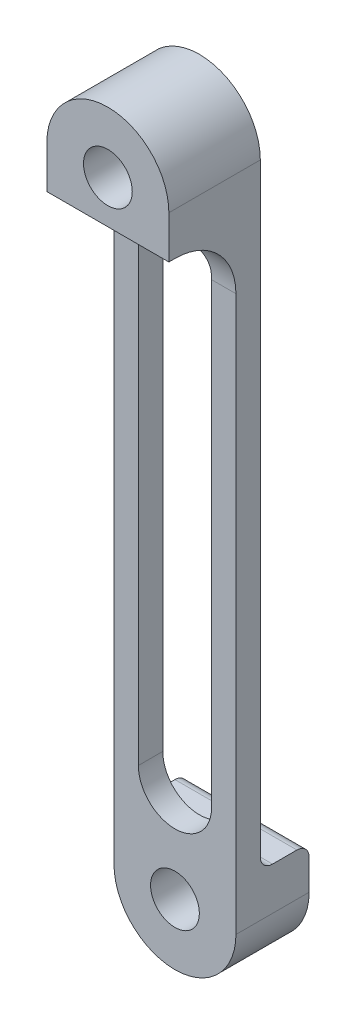
ISO-10303-21;
HEADER;
FILE_DESCRIPTION(('STEP AP214'),'2;1');
FILE_NAME('part.step','',(''),(''),'','','');
FILE_SCHEMA(('AUTOMOTIVE_DESIGN { 1 0 10303 214 1 1 1 1 }'));
ENDSEC;
DATA;
#1=APPLICATION_CONTEXT('core data for automotive mechanical design processes');
#2=APPLICATION_PROTOCOL_DEFINITION('international standard','automotive_design',2000,#1);
#3=PRODUCT_CONTEXT('',#1,'mechanical');
#4=PRODUCT('Part','Part','',(#3));
#5=PRODUCT_RELATED_PRODUCT_CATEGORY('part','',(#4));
#6=PRODUCT_DEFINITION_FORMATION('','',#4);
#7=PRODUCT_DEFINITION_CONTEXT('part definition',#1,'design');
#8=PRODUCT_DEFINITION('design','',#6,#7);
#9=PRODUCT_DEFINITION_SHAPE('','',#8);
#10=(LENGTH_UNIT() NAMED_UNIT(*) SI_UNIT(.MILLI.,.METRE.));
#11=(NAMED_UNIT(*) PLANE_ANGLE_UNIT() SI_UNIT($,.RADIAN.));
#12=(NAMED_UNIT(*) SI_UNIT($,.STERADIAN.) SOLID_ANGLE_UNIT());
#13=UNCERTAINTY_MEASURE_WITH_UNIT(LENGTH_MEASURE(1.E-05),#10,'distance_accuracy_value','');
#14=(GEOMETRIC_REPRESENTATION_CONTEXT(3) GLOBAL_UNCERTAINTY_ASSIGNED_CONTEXT((#13)) GLOBAL_UNIT_ASSIGNED_CONTEXT((#10,
#11,#12)) REPRESENTATION_CONTEXT('',''));
#15=CARTESIAN_POINT('',(0.,0.,0.));
#16=DIRECTION('',(0.,0.,1.));
#17=DIRECTION('',(1.,0.,0.));
#18=AXIS2_PLACEMENT_3D('',#15,#16,#17);
#19=CARTESIAN_POINT('',(0.,0.,4.));
#20=DIRECTION('',(0.,0.,1.));
#21=DIRECTION('',(1.,0.,0.));
#22=AXIS2_PLACEMENT_3D('',#19,#20,#21);
#23=PLANE('',#22);
#24=DIRECTION('',(0.,-1.,0.));
#25=VECTOR('',#24,1.);
#26=CARTESIAN_POINT('',(10.,0.,4.));
#27=LINE('',#26,#25);
#28=CARTESIAN_POINT('',(10.,37.,4.));
#29=VERTEX_POINT('',#28);
#30=CARTESIAN_POINT('',(9.99999999999999,-54.,4.));
#31=VERTEX_POINT('',#30);
#32=EDGE_CURVE('E320',#29,#31,#27,.T.);
#33=ORIENTED_EDGE('',*,*,#32,.F.);
#34=DIRECTION('',(-1.,0.,0.));
#35=VECTOR('',#34,1.);
#36=CARTESIAN_POINT('',(0.,37.,4.));
#37=LINE('',#36,#35);
#38=CARTESIAN_POINT('',(5.99999999999999,37.,4.));
#39=VERTEX_POINT('',#38);
#40=EDGE_CURVE('E419',#29,#39,#37,.T.);
#41=ORIENTED_EDGE('',*,*,#40,.T.);
#42=DIRECTION('',(0.,-1.,0.));
#43=VECTOR('',#42,1.);
#44=CARTESIAN_POINT('',(5.99999999999999,0.,4.));
#45=LINE('',#44,#43);
#46=CARTESIAN_POINT('',(5.99999999999999,-38.,4.));
#47=VERTEX_POINT('',#46);
#48=EDGE_CURVE('E332',#39,#47,#45,.T.);
#49=ORIENTED_EDGE('',*,*,#48,.T.);
#50=CARTESIAN_POINT('',(0.,-38.,4.));
#51=DIRECTION('',(0.,0.,1.));
#52=DIRECTION('',(1.,0.,0.));
#53=AXIS2_PLACEMENT_3D('',#50,#51,#52);
#54=CIRCLE('',#53,6.00000000000001);
#55=CARTESIAN_POINT('',(-6.00000000000002,-38.,4.));
#56=VERTEX_POINT('',#55);
#57=EDGE_CURVE('E321',#56,#47,#54,.T.);
#58=ORIENTED_EDGE('',*,*,#57,.F.);
#59=DIRECTION('',(0.,-1.,0.));
#60=VECTOR('',#59,1.);
#61=CARTESIAN_POINT('',(-6.00000000000002,0.,4.));
#62=LINE('',#61,#60);
#63=CARTESIAN_POINT('',(-6.00000000000002,37.,4.));
#64=VERTEX_POINT('',#63);
#65=EDGE_CURVE('E330',#64,#56,#62,.T.);
#66=ORIENTED_EDGE('',*,*,#65,.F.);
#67=DIRECTION('',(-1.,0.,0.));
#68=VECTOR('',#67,1.);
#69=CARTESIAN_POINT('',(0.,37.,4.));
#70=LINE('',#69,#68);
#71=CARTESIAN_POINT('',(-9.99999999999999,37.,4.));
#72=VERTEX_POINT('',#71);
#73=EDGE_CURVE('E411',#64,#72,#70,.T.);
#74=ORIENTED_EDGE('',*,*,#73,.T.);
#75=DIRECTION('',(0.,-1.,0.));
#76=VECTOR('',#75,1.);
#77=CARTESIAN_POINT('',(-9.99999999999999,0.,4.));
#78=LINE('',#77,#76);
#79=CARTESIAN_POINT('',(-9.99999999999999,-54.,4.));
#80=VERTEX_POINT('',#79);
#81=EDGE_CURVE('E318',#72,#80,#78,.T.);
#82=ORIENTED_EDGE('',*,*,#81,.T.);
#83=CARTESIAN_POINT('',(0.,-54.,4.));
#84=DIRECTION('',(0.,0.,1.));
#85=DIRECTION('',(1.,0.,0.));
#86=AXIS2_PLACEMENT_3D('',#83,#84,#85);
#87=CIRCLE('',#86,10.);
#88=EDGE_CURVE('E373',#80,#31,#87,.T.);
#89=ORIENTED_EDGE('',*,*,#88,.T.);
#90=EDGE_LOOP('',(#33,#41,#49,#58,#66,#74,#82,#89));
#91=FACE_BOUND('',#90,.T.);
#92=CARTESIAN_POINT('',(0.,-54.,4.));
#93=DIRECTION('',(0.,0.,1.));
#94=DIRECTION('',(1.,0.,0.));
#95=AXIS2_PLACEMENT_3D('',#92,#93,#94);
#96=CIRCLE('',#95,4.);
#97=CARTESIAN_POINT('',(3.99999999999999,-54.,4.));
#98=VERTEX_POINT('',#97);
#99=EDGE_CURVE('E312',#98,#98,#96,.T.);
#100=ORIENTED_EDGE('',*,*,#99,.F.);
#101=EDGE_LOOP('',(#100));
#102=FACE_BOUND('',#101,.T.);
#103=ADVANCED_FACE('F131',(#91,#102),#23,.T.);
#104=CARTESIAN_POINT('',(0.,0.,0.));
#105=DIRECTION('',(0.,0.,1.));
#106=DIRECTION('',(1.,0.,0.));
#107=AXIS2_PLACEMENT_3D('',#104,#105,#106);
#108=PLANE('',#107);
#109=DIRECTION('',(0.,-1.,0.));
#110=VECTOR('',#109,1.);
#111=CARTESIAN_POINT('',(10.,0.,0.));
#112=LINE('',#111,#110);
#113=CARTESIAN_POINT('',(10.,54.,0.));
#114=VERTEX_POINT('',#113);
#115=CARTESIAN_POINT('',(10.,-45.,0.));
#116=VERTEX_POINT('',#115);
#117=EDGE_CURVE('E253',#114,#116,#112,.T.);
#118=ORIENTED_EDGE('',*,*,#117,.T.);
#119=DIRECTION('',(1.,0.,0.));
#120=VECTOR('',#119,1.);
#121=CARTESIAN_POINT('',(-9.99999999999999,-45.,0.));
#122=LINE('',#121,#120);
#123=CARTESIAN_POINT('',(-9.99999999999999,-45.,0.));
#124=VERTEX_POINT('',#123);
#125=EDGE_CURVE('E398',#116,#124,#122,.F.);
#126=ORIENTED_EDGE('',*,*,#125,.T.);
#127=DIRECTION('',(0.,-1.,0.));
#128=VECTOR('',#127,1.);
#129=CARTESIAN_POINT('',(-9.99999999999999,0.,0.));
#130=LINE('',#129,#128);
#131=CARTESIAN_POINT('',(-9.99999999999999,54.,0.));
#132=VERTEX_POINT('',#131);
#133=EDGE_CURVE('E338',#132,#124,#130,.T.);
#134=ORIENTED_EDGE('',*,*,#133,.F.);
#135=CARTESIAN_POINT('',(0.,54.,0.));
#136=DIRECTION('',(0.,0.,1.));
#137=DIRECTION('',(1.,0.,0.));
#138=AXIS2_PLACEMENT_3D('',#135,#136,#137);
#139=CIRCLE('',#138,10.);
#140=EDGE_CURVE('E337',#114,#132,#139,.T.);
#141=ORIENTED_EDGE('',*,*,#140,.F.);
#142=EDGE_LOOP('',(#118,#126,#134,#141));
#143=FACE_BOUND('',#142,.T.);
#144=CARTESIAN_POINT('',(0.,-38.,0.));
#145=DIRECTION('',(0.,0.,1.));
#146=DIRECTION('',(1.,0.,0.));
#147=AXIS2_PLACEMENT_3D('',#144,#145,#146);
#148=CIRCLE('',#147,6.00000000000001);
#149=CARTESIAN_POINT('',(-6.00000000000002,-38.,0.));
#150=VERTEX_POINT('',#149);
#151=CARTESIAN_POINT('',(5.99999999999999,-38.,0.));
#152=VERTEX_POINT('',#151);
#153=EDGE_CURVE('E344',#150,#152,#148,.T.);
#154=ORIENTED_EDGE('',*,*,#153,.T.);
#155=DIRECTION('',(0.,-1.,0.));
#156=VECTOR('',#155,1.);
#157=CARTESIAN_POINT('',(5.99999999999999,0.,0.));
#158=LINE('',#157,#156);
#159=CARTESIAN_POINT('',(5.99999999999999,38.,0.));
#160=VERTEX_POINT('',#159);
#161=EDGE_CURVE('E322',#160,#152,#158,.T.);
#162=ORIENTED_EDGE('',*,*,#161,.F.);
#163=CARTESIAN_POINT('',(0.,38.,0.));
#164=DIRECTION('',(0.,0.,1.));
#165=DIRECTION('',(1.,0.,0.));
#166=AXIS2_PLACEMENT_3D('',#163,#164,#165);
#167=CIRCLE('',#166,6.00000000000001);
#168=CARTESIAN_POINT('',(-6.00000000000002,38.,0.));
#169=VERTEX_POINT('',#168);
#170=EDGE_CURVE('E352',#160,#169,#167,.T.);
#171=ORIENTED_EDGE('',*,*,#170,.T.);
#172=DIRECTION('',(0.,-1.,0.));
#173=VECTOR('',#172,1.);
#174=CARTESIAN_POINT('',(-6.00000000000002,0.,0.));
#175=LINE('',#174,#173);
#176=EDGE_CURVE('E349',#169,#150,#175,.T.);
#177=ORIENTED_EDGE('',*,*,#176,.T.);
#178=EDGE_LOOP('',(#154,#162,#171,#177));
#179=FACE_BOUND('',#178,.T.);
#180=ADVANCED_FACE('F481',(#143,#179),#108,.F.);
#181=CARTESIAN_POINT('',(5.99999999999999,0.,4.));
#182=DIRECTION('',(1.,0.,0.));
#183=DIRECTION('',(0.,0.,-1.));
#184=AXIS2_PLACEMENT_3D('',#181,#182,#183);
#185=PLANE('',#184);
#186=ORIENTED_EDGE('',*,*,#161,.T.);
#187=DIRECTION('',(0.,0.,-1.));
#188=VECTOR('',#187,1.);
#189=CARTESIAN_POINT('',(5.99999999999999,-38.,4.));
#190=LINE('',#189,#188);
#191=EDGE_CURVE('E258',#47,#152,#190,.T.);
#192=ORIENTED_EDGE('',*,*,#191,.F.);
#193=ORIENTED_EDGE('',*,*,#48,.F.);
#194=CARTESIAN_POINT('',(5.99999999999999,37.,14.));
#195=DIRECTION('',(1.,0.,0.));
#196=DIRECTION('',(0.,0.,-1.));
#197=AXIS2_PLACEMENT_3D('',#194,#195,#196);
#198=CIRCLE('',#197,10.);
#199=CARTESIAN_POINT('',(5.99999999999999,38.,4.0501256289338));
#200=VERTEX_POINT('',#199);
#201=EDGE_CURVE('E425',#39,#200,#198,.T.);
#202=ORIENTED_EDGE('',*,*,#201,.T.);
#203=DIRECTION('',(0.,0.,-1.));
#204=VECTOR('',#203,1.);
#205=CARTESIAN_POINT('',(5.99999999999999,38.,4.));
#206=LINE('',#205,#204);
#207=EDGE_CURVE('E160',#200,#160,#206,.T.);
#208=ORIENTED_EDGE('',*,*,#207,.T.);
#209=EDGE_LOOP('',(#186,#192,#193,#202,#208));
#210=FACE_BOUND('',#209,.T.);
#211=ADVANCED_FACE('F445',(#210),#185,.F.);
#212=CARTESIAN_POINT('',(0.,-38.,4.));
#213=DIRECTION('',(0.,0.,-1.));
#214=DIRECTION('',(-1.,0.,0.));
#215=AXIS2_PLACEMENT_3D('',#212,#213,#214);
#216=CYLINDRICAL_SURFACE('',#215,6.00000000000001);
#217=ORIENTED_EDGE('',*,*,#153,.F.);
#218=DIRECTION('',(0.,0.,-1.));
#219=VECTOR('',#218,1.);
#220=CARTESIAN_POINT('',(-6.00000000000002,-38.,4.));
#221=LINE('',#220,#219);
#222=EDGE_CURVE('E364',#56,#150,#221,.T.);
#223=ORIENTED_EDGE('',*,*,#222,.F.);
#224=ORIENTED_EDGE('',*,*,#57,.T.);
#225=ORIENTED_EDGE('',*,*,#191,.T.);
#226=EDGE_LOOP('',(#217,#223,#224,#225));
#227=FACE_BOUND('',#226,.T.);
#228=ADVANCED_FACE('F447',(#227),#216,.F.);
#229=CARTESIAN_POINT('',(-6.00000000000002,0.,4.));
#230=DIRECTION('',(1.,0.,0.));
#231=DIRECTION('',(0.,0.,-1.));
#232=AXIS2_PLACEMENT_3D('',#229,#230,#231);
#233=PLANE('',#232);
#234=ORIENTED_EDGE('',*,*,#176,.F.);
#235=DIRECTION('',(0.,0.,-1.));
#236=VECTOR('',#235,1.);
#237=CARTESIAN_POINT('',(-6.00000000000002,38.,4.));
#238=LINE('',#237,#236);
#239=CARTESIAN_POINT('',(-6.00000000000002,38.,4.0501256289338));
#240=VERTEX_POINT('',#239);
#241=EDGE_CURVE('E152',#240,#169,#238,.T.);
#242=ORIENTED_EDGE('',*,*,#241,.F.);
#243=CARTESIAN_POINT('',(-6.00000000000002,37.,14.));
#244=DIRECTION('',(1.,0.,0.));
#245=DIRECTION('',(0.,0.,-1.));
#246=AXIS2_PLACEMENT_3D('',#243,#244,#245);
#247=CIRCLE('',#246,10.);
#248=EDGE_CURVE('E434',#240,#64,#247,.F.);
#249=ORIENTED_EDGE('',*,*,#248,.T.);
#250=ORIENTED_EDGE('',*,*,#65,.T.);
#251=ORIENTED_EDGE('',*,*,#222,.T.);
#252=EDGE_LOOP('',(#234,#242,#249,#250,#251));
#253=FACE_BOUND('',#252,.T.);
#254=ADVANCED_FACE('F441',(#253),#233,.T.);
#255=CARTESIAN_POINT('',(0.,38.,4.));
#256=DIRECTION('',(0.,0.,-1.));
#257=DIRECTION('',(-1.,0.,0.));
#258=AXIS2_PLACEMENT_3D('',#255,#256,#257);
#259=CYLINDRICAL_SURFACE('',#258,6.00000000000001);
#260=ORIENTED_EDGE('',*,*,#170,.F.);
#261=ORIENTED_EDGE('',*,*,#207,.F.);
#262=CARTESIAN_POINT('',(5.99999999999999,38.,4.0501256289338));
#263=CARTESIAN_POINT('',(6.0000294951596,38.1591175187493,4.06608293057429));
#264=CARTESIAN_POINT('',(5.99367212509251,38.3178105674028,4.08592065296171));
#265=CARTESIAN_POINT('',(5.96860004965311,38.6330020197956,4.13295942524133));
#266=CARTESIAN_POINT('',(5.94989436154212,38.7895019399501,4.16015509350608));
#267=CARTESIAN_POINT('',(5.90069490388108,39.0982307316092,4.22134509223627));
#268=CARTESIAN_POINT('',(5.87027543348815,39.2504801632662,4.25529593229296));
#269=CARTESIAN_POINT('',(5.7981979236528,39.5507212780291,4.32954337511306));
#270=CARTESIAN_POINT('',(5.75653821567016,39.6987123253931,4.36984091963352));
#271=CARTESIAN_POINT('',(5.66273347676998,39.9891372133211,4.45600022435041));
#272=CARTESIAN_POINT('',(5.61061972958902,40.1315861551653,4.50184522510344));
#273=CARTESIAN_POINT('',(5.49646333293458,40.410737683907,4.59847226930764));
#274=CARTESIAN_POINT('',(5.43441688028624,40.5474380442883,4.64925620091144));
#275=CARTESIAN_POINT('',(5.23419168500289,40.9482931524451,4.80796840596734));
#276=CARTESIAN_POINT('',(5.08196517314529,41.2030861169894,4.92222183327461));
#277=CARTESIAN_POINT('',(4.72700902510743,41.7095847876954,5.17344560921815));
#278=CARTESIAN_POINT('',(4.52065498084985,41.9581576138449,5.311541599));
#279=CARTESIAN_POINT('',(4.07151863059318,42.4188676858128,5.59116780926577));
#280=CARTESIAN_POINT('',(3.82866845263922,42.6309354324219,5.73270400751313));
#281=CARTESIAN_POINT('',(3.42157838573368,42.9321887492625,5.94846075171384));
#282=CARTESIAN_POINT('',(3.26861110983556,43.0349235630671,6.02538504951066));
#283=CARTESIAN_POINT('',(2.95199395538532,43.2268537011576,6.17433589210791));
#284=CARTESIAN_POINT('',(2.78834099569062,43.3160450954189,6.2463610119323));
#285=CARTESIAN_POINT('',(2.45130504733917,43.4796072515253,6.38252058251944));
#286=CARTESIAN_POINT('',(2.27795188895556,43.5540205602045,6.44667747615086));
#287=CARTESIAN_POINT('',(1.92182067944011,43.6870608145333,6.56420100149436));
#288=CARTESIAN_POINT('',(1.73905022937201,43.7457002612277,6.61757616949508));
#289=CARTESIAN_POINT('',(1.43397156489431,43.8274126503987,6.6932702328874));
#290=CARTESIAN_POINT('',(1.31406535169195,43.8556429960359,6.71980054156605));
#291=CARTESIAN_POINT('',(1.07155591266237,43.9048336605978,6.76643763775028));
#292=CARTESIAN_POINT('',(0.948953551335206,43.92579627474,6.78654645306488));
#293=CARTESIAN_POINT('',(0.701890617956236,43.9601077108383,6.81964687541727));
#294=CARTESIAN_POINT('',(0.577432595240377,43.973466139441,6.83264746171744));
#295=CARTESIAN_POINT('',(0.327356567361795,43.9923751001517,6.85109330345357));
#296=CARTESIAN_POINT('',(0.201738529570265,43.9979254119561,6.8565383457122));
#297=CARTESIAN_POINT('',(-0.0499724301037092,44.0011148465854,6.85966412555106));
#298=CARTESIAN_POINT('',(-0.176065788765368,43.9987365405341,6.8573277578616));
#299=CARTESIAN_POINT('',(-0.427466693636261,43.9860767055142,6.8449452031245));
#300=CARTESIAN_POINT('',(-0.552774253039173,43.9757953095997,6.8348991458749));
#301=CARTESIAN_POINT('',(-0.801796803030101,43.9475069706706,6.80746687048065));
#302=CARTESIAN_POINT('',(-0.925510420988328,43.9294937748418,6.79007471162358));
#303=CARTESIAN_POINT('',(-1.17052168133062,43.8860320042462,6.74855441795779));
#304=CARTESIAN_POINT('',(-1.29181807779596,43.8605796958445,6.72442290098697));
#305=CARTESIAN_POINT('',(-1.55981238132584,43.795708710444,6.66373683110122));
#306=CARTESIAN_POINT('',(-1.70569646846691,43.7544084110676,6.62559283290449));
#307=CARTESIAN_POINT('',(-1.99202862151977,43.6616692511934,6.54171152006149));
#308=CARTESIAN_POINT('',(-2.1324726967012,43.6102231102552,6.49596875644075));
#309=CARTESIAN_POINT('',(-2.40757233010485,43.4977916186078,6.39840481262958));
#310=CARTESIAN_POINT('',(-2.54221802081884,43.4367907670592,6.3465737900893));
#311=CARTESIAN_POINT('',(-2.80513700162622,43.3059181214778,6.23838906480572));
#312=CARTESIAN_POINT('',(-2.93341239355271,43.2360492807928,6.18203687005764));
#313=CARTESIAN_POINT('',(-3.2160799982645,43.0685700626666,6.05100595078985));
#314=CARTESIAN_POINT('',(-3.36856518766068,42.9684755355649,5.97537877212671));
#315=CARTESIAN_POINT('',(-3.662942511868,42.7556130837321,5.82135778945502));
#316=CARTESIAN_POINT('',(-3.80483215528341,42.6428421938493,5.74296334110324));
#317=CARTESIAN_POINT('',(-4.07773930855389,42.4050894553705,5.58540787567962));
#318=CARTESIAN_POINT('',(-4.20874879444984,42.2800987401617,5.50624634010113));
#319=CARTESIAN_POINT('',(-4.45926102297536,42.0184315999573,5.3490672283874));
#320=CARTESIAN_POINT('',(-4.57876475258685,41.8817561791966,5.27104955461745));
#321=CARTESIAN_POINT('',(-4.8062789682288,41.5962753489477,5.11739403190589));
#322=CARTESIAN_POINT('',(-4.91421511860866,41.4474012099078,5.04177354638658));
#323=CARTESIAN_POINT('',(-5.11683605940352,41.1387974105401,4.8950818422026));
#324=CARTESIAN_POINT('',(-5.21152288702919,40.9790694247188,4.82400992506576));
#325=CARTESIAN_POINT('',(-5.38631824137914,40.649941477627,4.68820510923198));
#326=CARTESIAN_POINT('',(-5.46646945196341,40.4805718189937,4.62345391705684));
#327=CARTESIAN_POINT('',(-5.61132116732317,40.1327301449577,4.50158284717902));
#328=CARTESIAN_POINT('',(-5.67602624792147,39.9542608443301,4.44446071162887));
#329=CARTESIAN_POINT('',(-5.77574769459048,39.6316568969812,4.35138795932134));
#330=CARTESIAN_POINT('',(-5.8141694886886,39.4890977430194,4.31359303058179));
#331=CARTESIAN_POINT('',(-5.88060418386199,39.200190034776,4.24391278426973));
#332=CARTESIAN_POINT('',(-5.90862038748129,39.0538426985954,4.21202559330242));
#333=CARTESIAN_POINT('',(-5.95391289001359,38.7573184776507,4.15445585240362));
#334=CARTESIAN_POINT('',(-5.97112145039857,38.6071234618042,4.12881304114627));
#335=CARTESIAN_POINT('',(-5.99418207495812,38.3047491695015,4.0842974092484));
#336=CARTESIAN_POINT('',(-6.00002491238777,38.1525683817848,4.06543009911202));
#337=CARTESIAN_POINT('',(-6.00000000000001,38.,4.0501256289338));
#338=B_SPLINE_CURVE_WITH_KNOTS('',3,(#262,#263,#264,#265,#266,#267,#268,#269,#270,#271,#272,
#273,#274,#275,#276,#277,#278,#279,#280,#281,#282,#283,#284,#285,#286,#287,#288,#289,#290,#291,
#292,#293,#294,#295,#296,#297,#298,#299,#300,#301,#302,#303,#304,#305,#306,#307,#308,#309,#310,
#311,#312,#313,#314,#315,#316,#317,#318,#319,#320,#321,#322,#323,#324,#325,#326,#327,#328,#329,
#330,#331,#332,#333,#334,#335,#336,#337),.UNSPECIFIED.,.F.,.F.,(4,2,2,2,2,2,2,2,2,2,2,2,2,2,2,2,
2,2,2,2,2,2,2,2,2,2,2,2,2,2,2,2,2,2,2,2,2,4),(0.,0.479521694057924,0.958693607982544,
1.4348749640435,1.9111270450595,2.38597464886377,2.86100450583572,3.81144088218074,
4.86166678762596,5.91387053962458,6.51224019448164,7.11078315356829,7.70757706674632,
8.30389660809757,8.68157362710421,9.05913126329832,9.43621085241886,9.81330108050651,
10.1912207834066,10.5691341239017,10.9473536657053,11.3257633599833,11.7941017538637,
12.2627774483357,12.7322215161025,13.2015096509353,13.7931124981155,14.3848540173184,
14.9770281321084,15.569151403925,16.1648765737993,16.7605100443156,17.3543650680643,
17.9480439469148,18.4047868716972,18.8613847105076,19.3208165105854,19.7806211240662),.UNSPECIFIED.);
#339=EDGE_CURVE('E430',#200,#240,#338,.T.);
#340=ORIENTED_EDGE('',*,*,#339,.T.);
#341=ORIENTED_EDGE('',*,*,#241,.T.);
#342=EDGE_LOOP('',(#260,#261,#340,#341));
#343=FACE_BOUND('',#342,.T.);
#344=ADVANCED_FACE('F436',(#343),#259,.F.);
#345=CARTESIAN_POINT('',(10.,0.,4.));
#346=DIRECTION('',(1.,0.,0.));
#347=DIRECTION('',(0.,0.,-1.));
#348=AXIS2_PLACEMENT_3D('',#345,#346,#347);
#349=PLANE('',#348);
#350=CARTESIAN_POINT('',(10.,-45.,-2.));
#351=DIRECTION('',(1.,0.,0.));
#352=DIRECTION('',(0.,0.,-1.));
#353=AXIS2_PLACEMENT_3D('',#350,#351,#352);
#354=CIRCLE('',#353,2.);
#355=CARTESIAN_POINT('',(10.,-47.,-2.));
#356=VERTEX_POINT('',#355);
#357=EDGE_CURVE('E404',#356,#116,#354,.F.);
#358=ORIENTED_EDGE('',*,*,#357,.T.);
#359=ORIENTED_EDGE('',*,*,#117,.F.);
#360=DIRECTION('',(0.,0.,-1.));
#361=VECTOR('',#360,1.);
#362=CARTESIAN_POINT('',(10.,54.,4.));
#363=LINE('',#362,#361);
#364=CARTESIAN_POINT('',(10.,54.,15.));
#365=VERTEX_POINT('',#364);
#366=EDGE_CURVE('E247',#365,#114,#363,.T.);
#367=ORIENTED_EDGE('',*,*,#366,.F.);
#368=DIRECTION('',(0.,-1.,0.));
#369=VECTOR('',#368,1.);
#370=CARTESIAN_POINT('',(10.,0.,15.));
#371=LINE('',#370,#369);
#372=CARTESIAN_POINT('',(10.,47.,15.));
#373=VERTEX_POINT('',#372);
#374=EDGE_CURVE('E251',#365,#373,#371,.T.);
#375=ORIENTED_EDGE('',*,*,#374,.T.);
#376=DIRECTION('',(0.,0.,-1.));
#377=VECTOR('',#376,1.);
#378=CARTESIAN_POINT('',(10.,47.,15.));
#379=LINE('',#378,#377);
#380=CARTESIAN_POINT('',(10.,47.,14.));
#381=VERTEX_POINT('',#380);
#382=EDGE_CURVE('E289',#373,#381,#379,.T.);
#383=ORIENTED_EDGE('',*,*,#382,.T.);
#384=CARTESIAN_POINT('',(10.,37.,14.));
#385=DIRECTION('',(1.,0.,0.));
#386=DIRECTION('',(0.,0.,-1.));
#387=AXIS2_PLACEMENT_3D('',#384,#385,#386);
#388=CIRCLE('',#387,10.);
#389=EDGE_CURVE('E12',#381,#29,#388,.F.);
#390=ORIENTED_EDGE('',*,*,#389,.T.);
#391=ORIENTED_EDGE('',*,*,#32,.T.);
#392=DIRECTION('',(0.,0.,-1.));
#393=VECTOR('',#392,1.);
#394=CARTESIAN_POINT('',(9.99999999999999,-54.,4.));
#395=LINE('',#394,#393);
#396=CARTESIAN_POINT('',(10.,-54.,-8.));
#397=VERTEX_POINT('',#396);
#398=EDGE_CURVE('E380',#31,#397,#395,.T.);
#399=ORIENTED_EDGE('',*,*,#398,.T.);
#400=DIRECTION('',(0.,-1.,0.));
#401=VECTOR('',#400,1.);
#402=CARTESIAN_POINT('',(10.,0.,-8.));
#403=LINE('',#402,#401);
#404=CARTESIAN_POINT('',(10.,-49.,-8.));
#405=VERTEX_POINT('',#404);
#406=EDGE_CURVE('E304',#405,#397,#403,.T.);
#407=ORIENTED_EDGE('',*,*,#406,.F.);
#408=CARTESIAN_POINT('',(10.,-49.,-6.));
#409=DIRECTION('',(1.,0.,0.));
#410=DIRECTION('',(0.,0.,-1.));
#411=AXIS2_PLACEMENT_3D('',#408,#409,#410);
#412=CIRCLE('',#411,2.);
#413=CARTESIAN_POINT('',(10.,-47.,-6.));
#414=VERTEX_POINT('',#413);
#415=EDGE_CURVE('E390',#405,#414,#412,.T.);
#416=ORIENTED_EDGE('',*,*,#415,.T.);
#417=DIRECTION('',(0.,0.,1.));
#418=VECTOR('',#417,1.);
#419=CARTESIAN_POINT('',(10.,-47.,-8.));
#420=LINE('',#419,#418);
#421=EDGE_CURVE('E308',#414,#356,#420,.T.);
#422=ORIENTED_EDGE('',*,*,#421,.T.);
#423=EDGE_LOOP('',(#358,#359,#367,#375,#383,#390,#391,#399,#407,#416,#422));
#424=FACE_BOUND('',#423,.T.);
#425=ADVANCED_FACE('F252',(#424),#349,.T.);
#426=CARTESIAN_POINT('',(-9.99999999999999,0.,4.));
#427=DIRECTION('',(1.,0.,0.));
#428=DIRECTION('',(0.,0.,-1.));
#429=AXIS2_PLACEMENT_3D('',#426,#427,#428);
#430=PLANE('',#429);
#431=ORIENTED_EDGE('',*,*,#81,.F.);
#432=CARTESIAN_POINT('',(-9.99999999999999,37.,14.));
#433=DIRECTION('',(1.,0.,0.));
#434=DIRECTION('',(0.,0.,-1.));
#435=AXIS2_PLACEMENT_3D('',#432,#433,#434);
#436=CIRCLE('',#435,10.);
#437=CARTESIAN_POINT('',(-9.99999999999999,47.,14.));
#438=VERTEX_POINT('',#437);
#439=EDGE_CURVE('E144',#72,#438,#436,.T.);
#440=ORIENTED_EDGE('',*,*,#439,.T.);
#441=DIRECTION('',(0.,0.,-1.));
#442=VECTOR('',#441,1.);
#443=CARTESIAN_POINT('',(-9.99999999999999,47.,15.));
#444=LINE('',#443,#442);
#445=CARTESIAN_POINT('',(-9.99999999999999,47.,15.));
#446=VERTEX_POINT('',#445);
#447=EDGE_CURVE('E288',#446,#438,#444,.T.);
#448=ORIENTED_EDGE('',*,*,#447,.F.);
#449=DIRECTION('',(0.,-1.,0.));
#450=VECTOR('',#449,1.);
#451=CARTESIAN_POINT('',(-9.99999999999999,0.,15.));
#452=LINE('',#451,#450);
#453=CARTESIAN_POINT('',(-9.99999999999999,54.,15.));
#454=VERTEX_POINT('',#453);
#455=EDGE_CURVE('E272',#454,#446,#452,.T.);
#456=ORIENTED_EDGE('',*,*,#455,.F.);
#457=DIRECTION('',(0.,0.,-1.));
#458=VECTOR('',#457,1.);
#459=CARTESIAN_POINT('',(-9.99999999999999,54.,4.));
#460=LINE('',#459,#458);
#461=EDGE_CURVE('E262',#454,#132,#460,.T.);
#462=ORIENTED_EDGE('',*,*,#461,.T.);
#463=ORIENTED_EDGE('',*,*,#133,.T.);
#464=CARTESIAN_POINT('',(-9.99999999999999,-45.,-2.));
#465=DIRECTION('',(1.,0.,0.));
#466=DIRECTION('',(0.,0.,-1.));
#467=AXIS2_PLACEMENT_3D('',#464,#465,#466);
#468=CIRCLE('',#467,2.);
#469=CARTESIAN_POINT('',(-9.99999999999999,-47.,-2.));
#470=VERTEX_POINT('',#469);
#471=EDGE_CURVE('E410',#124,#470,#468,.T.);
#472=ORIENTED_EDGE('',*,*,#471,.T.);
#473=DIRECTION('',(0.,0.,1.));
#474=VECTOR('',#473,1.);
#475=CARTESIAN_POINT('',(-9.99999999999999,-47.,-8.));
#476=LINE('',#475,#474);
#477=CARTESIAN_POINT('',(-9.99999999999999,-47.,-6.));
#478=VERTEX_POINT('',#477);
#479=EDGE_CURVE('E307',#478,#470,#476,.T.);
#480=ORIENTED_EDGE('',*,*,#479,.F.);
#481=CARTESIAN_POINT('',(-9.99999999999999,-49.,-6.));
#482=DIRECTION('',(1.,0.,0.));
#483=DIRECTION('',(0.,0.,-1.));
#484=AXIS2_PLACEMENT_3D('',#481,#482,#483);
#485=CIRCLE('',#484,2.);
#486=CARTESIAN_POINT('',(-9.99999999999999,-49.,-8.));
#487=VERTEX_POINT('',#486);
#488=EDGE_CURVE('E399',#478,#487,#485,.F.);
#489=ORIENTED_EDGE('',*,*,#488,.T.);
#490=DIRECTION('',(0.,-1.,0.));
#491=VECTOR('',#490,1.);
#492=CARTESIAN_POINT('',(-9.99999999999999,0.,-8.));
#493=LINE('',#492,#491);
#494=CARTESIAN_POINT('',(-9.99999999999999,-54.,-8.));
#495=VERTEX_POINT('',#494);
#496=EDGE_CURVE('E296',#487,#495,#493,.T.);
#497=ORIENTED_EDGE('',*,*,#496,.T.);
#498=DIRECTION('',(0.,0.,-1.));
#499=VECTOR('',#498,1.);
#500=CARTESIAN_POINT('',(-9.99999999999999,-54.,4.));
#501=LINE('',#500,#499);
#502=EDGE_CURVE('E340',#80,#495,#501,.T.);
#503=ORIENTED_EDGE('',*,*,#502,.F.);
#504=EDGE_LOOP('',(#431,#440,#448,#456,#462,#463,#472,#480,#489,#497,#503));
#505=FACE_BOUND('',#504,.T.);
#506=ADVANCED_FACE('F448',(#505),#430,.F.);
#507=CARTESIAN_POINT('',(0.,54.,4.));
#508=DIRECTION('',(0.,0.,-1.));
#509=DIRECTION('',(-1.,0.,0.));
#510=AXIS2_PLACEMENT_3D('',#507,#508,#509);
#511=CYLINDRICAL_SURFACE('',#510,10.);
#512=ORIENTED_EDGE('',*,*,#140,.T.);
#513=ORIENTED_EDGE('',*,*,#461,.F.);
#514=CARTESIAN_POINT('',(0.,54.,15.));
#515=DIRECTION('',(0.,0.,1.));
#516=DIRECTION('',(1.,0.,0.));
#517=AXIS2_PLACEMENT_3D('',#514,#515,#516);
#518=CIRCLE('',#517,10.);
#519=EDGE_CURVE('E261',#365,#454,#518,.T.);
#520=ORIENTED_EDGE('',*,*,#519,.F.);
#521=ORIENTED_EDGE('',*,*,#366,.T.);
#522=EDGE_LOOP('',(#512,#513,#520,#521));
#523=FACE_BOUND('',#522,.T.);
#524=ADVANCED_FACE('F263',(#523),#511,.T.);
#525=CARTESIAN_POINT('',(0.,-54.,4.));
#526=DIRECTION('',(0.,0.,-1.));
#527=DIRECTION('',(-1.,0.,0.));
#528=AXIS2_PLACEMENT_3D('',#525,#526,#527);
#529=CYLINDRICAL_SURFACE('',#528,4.);
#530=ORIENTED_EDGE('',*,*,#99,.T.);
#531=EDGE_LOOP('',(#530));
#532=FACE_BOUND('',#531,.T.);
#533=CARTESIAN_POINT('',(0.,-54.,-8.));
#534=DIRECTION('',(0.,0.,1.));
#535=DIRECTION('',(1.,0.,0.));
#536=AXIS2_PLACEMENT_3D('',#533,#534,#535);
#537=CIRCLE('',#536,4.);
#538=CARTESIAN_POINT('',(3.99999999999999,-54.,-8.));
#539=VERTEX_POINT('',#538);
#540=EDGE_CURVE('E295',#539,#539,#537,.T.);
#541=ORIENTED_EDGE('',*,*,#540,.F.);
#542=EDGE_LOOP('',(#541));
#543=FACE_BOUND('',#542,.T.);
#544=ADVANCED_FACE('F457',(#532,#543),#529,.F.);
#545=CARTESIAN_POINT('',(0.,-54.,4.));
#546=DIRECTION('',(0.,0.,-1.));
#547=DIRECTION('',(-1.,0.,0.));
#548=AXIS2_PLACEMENT_3D('',#545,#546,#547);
#549=CYLINDRICAL_SURFACE('',#548,10.);
#550=ORIENTED_EDGE('',*,*,#502,.T.);
#551=CARTESIAN_POINT('',(0.,-54.,-8.));
#552=DIRECTION('',(0.,0.,1.));
#553=DIRECTION('',(1.,0.,0.));
#554=AXIS2_PLACEMENT_3D('',#551,#552,#553);
#555=CIRCLE('',#554,10.);
#556=EDGE_CURVE('E301',#495,#397,#555,.T.);
#557=ORIENTED_EDGE('',*,*,#556,.T.);
#558=ORIENTED_EDGE('',*,*,#398,.F.);
#559=ORIENTED_EDGE('',*,*,#88,.F.);
#560=EDGE_LOOP('',(#550,#557,#558,#559));
#561=FACE_BOUND('',#560,.T.);
#562=ADVANCED_FACE('F462',(#561),#549,.T.);
#563=CARTESIAN_POINT('',(0.,-47.,-8.));
#564=DIRECTION('',(0.,-1.,0.));
#565=DIRECTION('',(0.,0.,-1.));
#566=AXIS2_PLACEMENT_3D('',#563,#564,#565);
#567=PLANE('',#566);
#568=ORIENTED_EDGE('',*,*,#421,.F.);
#569=DIRECTION('',(1.,0.,0.));
#570=VECTOR('',#569,1.);
#571=CARTESIAN_POINT('',(0.,-47.,-6.));
#572=LINE('',#571,#570);
#573=EDGE_CURVE('E391',#414,#478,#572,.F.);
#574=ORIENTED_EDGE('',*,*,#573,.T.);
#575=ORIENTED_EDGE('',*,*,#479,.T.);
#576=DIRECTION('',(1.,0.,0.));
#577=VECTOR('',#576,1.);
#578=CARTESIAN_POINT('',(10.,-47.,-2.));
#579=LINE('',#578,#577);
#580=EDGE_CURVE('E388',#470,#356,#579,.T.);
#581=ORIENTED_EDGE('',*,*,#580,.T.);
#582=EDGE_LOOP('',(#568,#574,#575,#581));
#583=FACE_BOUND('',#582,.T.);
#584=ADVANCED_FACE('F463',(#583),#567,.F.);
#585=CARTESIAN_POINT('',(0.,0.,-8.));
#586=DIRECTION('',(0.,0.,1.));
#587=DIRECTION('',(1.,0.,0.));
#588=AXIS2_PLACEMENT_3D('',#585,#586,#587);
#589=PLANE('',#588);
#590=ORIENTED_EDGE('',*,*,#540,.T.);
#591=EDGE_LOOP('',(#590));
#592=FACE_BOUND('',#591,.T.);
#593=ORIENTED_EDGE('',*,*,#496,.F.);
#594=DIRECTION('',(1.,0.,0.));
#595=VECTOR('',#594,1.);
#596=CARTESIAN_POINT('',(0.,-49.,-8.));
#597=LINE('',#596,#595);
#598=EDGE_CURVE('E370',#487,#405,#597,.T.);
#599=ORIENTED_EDGE('',*,*,#598,.T.);
#600=ORIENTED_EDGE('',*,*,#406,.T.);
#601=ORIENTED_EDGE('',*,*,#556,.F.);
#602=EDGE_LOOP('',(#593,#599,#600,#601));
#603=FACE_BOUND('',#602,.T.);
#604=ADVANCED_FACE('F468',(#592,#603),#589,.F.);
#605=CARTESIAN_POINT('',(0.,-49.,-6.));
#606=DIRECTION('',(1.,0.,0.));
#607=DIRECTION('',(0.,0.,-1.));
#608=AXIS2_PLACEMENT_3D('',#605,#606,#607);
#609=CYLINDRICAL_SURFACE('',#608,2.);
#610=ORIENTED_EDGE('',*,*,#488,.F.);
#611=ORIENTED_EDGE('',*,*,#573,.F.);
#612=ORIENTED_EDGE('',*,*,#415,.F.);
#613=ORIENTED_EDGE('',*,*,#598,.F.);
#614=EDGE_LOOP('',(#610,#611,#612,#613));
#615=FACE_BOUND('',#614,.T.);
#616=ADVANCED_FACE('F470',(#615),#609,.T.);
#617=CARTESIAN_POINT('',(0.,-45.,-2.));
#618=DIRECTION('',(-1.,0.,0.));
#619=DIRECTION('',(0.,0.,1.));
#620=AXIS2_PLACEMENT_3D('',#617,#618,#619);
#621=CYLINDRICAL_SURFACE('',#620,2.);
#622=ORIENTED_EDGE('',*,*,#471,.F.);
#623=ORIENTED_EDGE('',*,*,#125,.F.);
#624=ORIENTED_EDGE('',*,*,#357,.F.);
#625=ORIENTED_EDGE('',*,*,#580,.F.);
#626=EDGE_LOOP('',(#622,#623,#624,#625));
#627=FACE_BOUND('',#626,.T.);
#628=ADVANCED_FACE('F469',(#627),#621,.F.);
#629=CARTESIAN_POINT('',(0.,54.,15.));
#630=DIRECTION('',(0.,0.,-1.));
#631=DIRECTION('',(-1.,0.,0.));
#632=AXIS2_PLACEMENT_3D('',#629,#630,#631);
#633=CYLINDRICAL_SURFACE('',#632,4.);
#634=CARTESIAN_POINT('',(0.,54.,4.));
#635=DIRECTION('',(0.,0.,1.));
#636=DIRECTION('',(1.,0.,0.));
#637=AXIS2_PLACEMENT_3D('',#634,#635,#636);
#638=CIRCLE('',#637,4.);
#639=CARTESIAN_POINT('',(3.99999999999999,54.,4.));
#640=VERTEX_POINT('',#639);
#641=EDGE_CURVE('E408',#640,#640,#638,.F.);
#642=ORIENTED_EDGE('',*,*,#641,.T.);
#643=EDGE_LOOP('',(#642));
#644=FACE_BOUND('',#643,.T.);
#645=CARTESIAN_POINT('',(0.,54.,15.));
#646=DIRECTION('',(0.,0.,1.));
#647=DIRECTION('',(1.,0.,0.));
#648=AXIS2_PLACEMENT_3D('',#645,#646,#647);
#649=CIRCLE('',#648,4.);
#650=CARTESIAN_POINT('',(3.99999999999999,54.,15.));
#651=VERTEX_POINT('',#650);
#652=EDGE_CURVE('E280',#651,#651,#649,.T.);
#653=ORIENTED_EDGE('',*,*,#652,.T.);
#654=EDGE_LOOP('',(#653));
#655=FACE_BOUND('',#654,.T.);
#656=ADVANCED_FACE('F474',(#644,#655),#633,.F.);
#657=CARTESIAN_POINT('',(0.,47.,15.));
#658=DIRECTION('',(0.,1.,0.));
#659=DIRECTION('',(0.,0.,1.));
#660=AXIS2_PLACEMENT_3D('',#657,#658,#659);
#661=PLANE('',#660);
#662=ORIENTED_EDGE('',*,*,#447,.T.);
#663=DIRECTION('',(-1.,0.,0.));
#664=VECTOR('',#663,1.);
#665=CARTESIAN_POINT('',(0.,47.,14.));
#666=LINE('',#665,#664);
#667=EDGE_CURVE('E423',#438,#381,#666,.F.);
#668=ORIENTED_EDGE('',*,*,#667,.T.);
#669=ORIENTED_EDGE('',*,*,#382,.F.);
#670=DIRECTION('',(1.,0.,0.));
#671=VECTOR('',#670,1.);
#672=CARTESIAN_POINT('',(0.,47.,15.));
#673=LINE('',#672,#671);
#674=EDGE_CURVE('E274',#446,#373,#673,.T.);
#675=ORIENTED_EDGE('',*,*,#674,.F.);
#676=EDGE_LOOP('',(#662,#668,#669,#675));
#677=FACE_BOUND('',#676,.T.);
#678=ADVANCED_FACE('F476',(#677),#661,.F.);
#679=CARTESIAN_POINT('',(0.,0.,15.));
#680=DIRECTION('',(0.,0.,1.));
#681=DIRECTION('',(1.,0.,0.));
#682=AXIS2_PLACEMENT_3D('',#679,#680,#681);
#683=PLANE('',#682);
#684=ORIENTED_EDGE('',*,*,#652,.F.);
#685=EDGE_LOOP('',(#684));
#686=FACE_BOUND('',#685,.T.);
#687=ORIENTED_EDGE('',*,*,#374,.F.);
#688=ORIENTED_EDGE('',*,*,#519,.T.);
#689=ORIENTED_EDGE('',*,*,#455,.T.);
#690=ORIENTED_EDGE('',*,*,#674,.T.);
#691=EDGE_LOOP('',(#687,#688,#689,#690));
#692=FACE_BOUND('',#691,.T.);
#693=ADVANCED_FACE('F271',(#686,#692),#683,.T.);
#694=ORIENTED_EDGE('',*,*,#641,.F.);
#695=EDGE_LOOP('',(#694));
#696=FACE_BOUND('',#695,.T.);
#697=ADVANCED_FACE('F487',(#696),#23,.T.);
#698=CARTESIAN_POINT('',(0.,37.,14.));
#699=DIRECTION('',(-1.,0.,0.));
#700=DIRECTION('',(0.,0.,1.));
#701=AXIS2_PLACEMENT_3D('',#698,#699,#700);
#702=CYLINDRICAL_SURFACE('',#701,10.);
#703=ORIENTED_EDGE('',*,*,#389,.F.);
#704=ORIENTED_EDGE('',*,*,#667,.F.);
#705=ORIENTED_EDGE('',*,*,#439,.F.);
#706=ORIENTED_EDGE('',*,*,#73,.F.);
#707=ORIENTED_EDGE('',*,*,#248,.F.);
#708=ORIENTED_EDGE('',*,*,#339,.F.);
#709=ORIENTED_EDGE('',*,*,#201,.F.);
#710=ORIENTED_EDGE('',*,*,#40,.F.);
#711=EDGE_LOOP('',(#703,#704,#705,#706,#707,#708,#709,#710));
#712=FACE_BOUND('',#711,.T.);
#713=ADVANCED_FACE('F137',(#712),#702,.F.);
#714=CLOSED_SHELL('',(#103,#180,#211,#228,#254,#344,#425,#506,#524,#544,#562,#584,#604,#616,
#628,#656,#678,#693,#697,#713));
#715=MANIFOLD_SOLID_BREP('B2',#714);
#716=ADVANCED_BREP_SHAPE_REPRESENTATION('',(#18,#715),#14);
#717=SHAPE_DEFINITION_REPRESENTATION(#9,#716);
ENDSEC;
END-ISO-10303-21;
